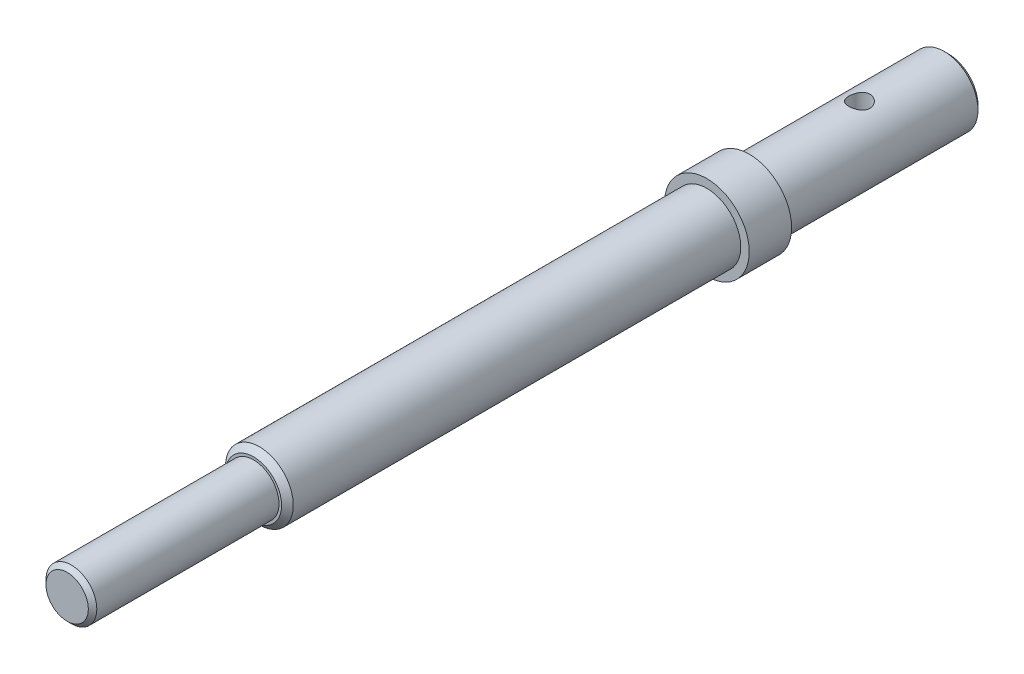
ISO-10303-21;
HEADER;
FILE_DESCRIPTION(('STEP AP214'),'2;1');
FILE_NAME('part.step','',(''),(''),'','','');
FILE_SCHEMA(('AUTOMOTIVE_DESIGN { 1 0 10303 214 1 1 1 1 }'));
ENDSEC;
DATA;
#1=APPLICATION_CONTEXT('core data for automotive mechanical design processes');
#2=APPLICATION_PROTOCOL_DEFINITION('international standard','automotive_design',2000,#1);
#3=PRODUCT_CONTEXT('',#1,'mechanical');
#4=PRODUCT('Part','Part','',(#3));
#5=PRODUCT_RELATED_PRODUCT_CATEGORY('part','',(#4));
#6=PRODUCT_DEFINITION_FORMATION('','',#4);
#7=PRODUCT_DEFINITION_CONTEXT('part definition',#1,'design');
#8=PRODUCT_DEFINITION('design','',#6,#7);
#9=PRODUCT_DEFINITION_SHAPE('','',#8);
#10=(LENGTH_UNIT() NAMED_UNIT(*) SI_UNIT(.MILLI.,.METRE.));
#11=(NAMED_UNIT(*) PLANE_ANGLE_UNIT() SI_UNIT($,.RADIAN.));
#12=(NAMED_UNIT(*) SI_UNIT($,.STERADIAN.) SOLID_ANGLE_UNIT());
#13=UNCERTAINTY_MEASURE_WITH_UNIT(LENGTH_MEASURE(1.E-05),#10,'distance_accuracy_value','');
#14=(GEOMETRIC_REPRESENTATION_CONTEXT(3) GLOBAL_UNCERTAINTY_ASSIGNED_CONTEXT((#13)) GLOBAL_UNIT_ASSIGNED_CONTEXT((#10,
#11,#12)) REPRESENTATION_CONTEXT('',''));
#15=CARTESIAN_POINT('',(0.,0.,0.));
#16=DIRECTION('',(0.,0.,1.));
#17=DIRECTION('',(1.,0.,0.));
#18=AXIS2_PLACEMENT_3D('',#15,#16,#17);
#19=CARTESIAN_POINT('',(0.,0.,52.));
#20=DIRECTION('',(0.,0.,-1.));
#21=DIRECTION('',(-1.,0.,0.));
#22=AXIS2_PLACEMENT_3D('',#19,#20,#21);
#23=CYLINDRICAL_SURFACE('',#22,4.);
#24=CARTESIAN_POINT('',(0.,0.,29.3095));
#25=DIRECTION('',(0.,0.,-1.));
#26=DIRECTION('',(-1.,0.,0.));
#27=AXIS2_PLACEMENT_3D('',#24,#25,#26);
#28=CIRCLE('',#27,4.);
#29=CARTESIAN_POINT('',(-4.,0.,29.3095));
#30=VERTEX_POINT('',#29);
#31=EDGE_CURVE('E138',#30,#30,#28,.T.);
#32=CARTESIAN_POINT('',(0.,0.,-23.5));
#33=DIRECTION('',(0.,0.,1.));
#34=DIRECTION('',(1.,0.,0.));
#35=AXIS2_PLACEMENT_3D('',#32,#33,#34);
#36=CIRCLE('',#35,4.);
#37=CARTESIAN_POINT('',(-4.,0.,-23.5));
#38=VERTEX_POINT('',#37);
#39=EDGE_CURVE('E145',#38,#38,#36,.T.);
#40=CARTESIAN_POINT('',(-4.,0.,29.3095));
#41=CARTESIAN_POINT('',(-4.,0.,28.7594010416667));
#42=CARTESIAN_POINT('',(-4.,0.,28.2093020833333));
#43=CARTESIAN_POINT('',(-4.,0.,27.1091041666667));
#44=CARTESIAN_POINT('',(-4.,0.,26.5590052083333));
#45=CARTESIAN_POINT('',(-4.,0.,25.4588072916667));
#46=CARTESIAN_POINT('',(-4.,0.,24.9087083333333));
#47=CARTESIAN_POINT('',(-4.,0.,23.8085104166667));
#48=CARTESIAN_POINT('',(-4.,0.,23.2584114583333));
#49=CARTESIAN_POINT('',(-4.,0.,22.1582135416667));
#50=CARTESIAN_POINT('',(-4.,0.,21.6081145833333));
#51=CARTESIAN_POINT('',(-4.,0.,20.5079166666667));
#52=CARTESIAN_POINT('',(-4.,0.,19.9578177083333));
#53=CARTESIAN_POINT('',(-4.,0.,18.8576197916667));
#54=CARTESIAN_POINT('',(-4.,0.,18.3075208333333));
#55=CARTESIAN_POINT('',(-4.,0.,17.2073229166667));
#56=CARTESIAN_POINT('',(-4.,0.,16.6572239583333));
#57=CARTESIAN_POINT('',(-4.,0.,15.5570260416667));
#58=CARTESIAN_POINT('',(-4.,0.,15.0069270833333));
#59=CARTESIAN_POINT('',(-4.,0.,13.9067291666667));
#60=CARTESIAN_POINT('',(-4.,0.,13.3566302083333));
#61=CARTESIAN_POINT('',(-4.,0.,12.2564322916667));
#62=CARTESIAN_POINT('',(-4.,0.,11.7063333333333));
#63=CARTESIAN_POINT('',(-4.,0.,10.6061354166667));
#64=CARTESIAN_POINT('',(-4.,0.,10.0560364583333));
#65=CARTESIAN_POINT('',(-4.,0.,8.95583854166667));
#66=CARTESIAN_POINT('',(-4.,0.,8.40573958333334));
#67=CARTESIAN_POINT('',(-4.,0.,7.30554166666667));
#68=CARTESIAN_POINT('',(-4.,0.,6.75544270833334));
#69=CARTESIAN_POINT('',(-4.,0.,5.65524479166668));
#70=CARTESIAN_POINT('',(-4.,0.,5.10514583333334));
#71=CARTESIAN_POINT('',(-4.,0.,4.00494791666667));
#72=CARTESIAN_POINT('',(-4.,0.,3.45484895833334));
#73=CARTESIAN_POINT('',(-4.,0.,2.35465104166667));
#74=CARTESIAN_POINT('',(-4.,0.,1.80455208333333));
#75=CARTESIAN_POINT('',(-4.,0.,0.704354166666666));
#76=CARTESIAN_POINT('',(-4.,0.,0.154255208333333));
#77=CARTESIAN_POINT('',(-4.,0.,-0.945942708333332));
#78=CARTESIAN_POINT('',(-4.,0.,-1.49604166666667));
#79=CARTESIAN_POINT('',(-4.,0.,-2.59623958333333));
#80=CARTESIAN_POINT('',(-4.,0.,-3.14633854166666));
#81=CARTESIAN_POINT('',(-4.,0.,-4.24653645833333));
#82=CARTESIAN_POINT('',(-4.,0.,-4.79663541666667));
#83=CARTESIAN_POINT('',(-4.,0.,-5.89683333333333));
#84=CARTESIAN_POINT('',(-4.,0.,-6.44693229166667));
#85=CARTESIAN_POINT('',(-4.,0.,-7.54713020833333));
#86=CARTESIAN_POINT('',(-4.,0.,-8.09722916666666));
#87=CARTESIAN_POINT('',(-4.,0.,-9.19742708333333));
#88=CARTESIAN_POINT('',(-4.,0.,-9.74752604166667));
#89=CARTESIAN_POINT('',(-4.,0.,-10.8477239583333));
#90=CARTESIAN_POINT('',(-4.,0.,-11.3978229166667));
#91=CARTESIAN_POINT('',(-4.,0.,-12.4980208333333));
#92=CARTESIAN_POINT('',(-4.,0.,-13.0481197916667));
#93=CARTESIAN_POINT('',(-4.,0.,-14.1483177083333));
#94=CARTESIAN_POINT('',(-4.,0.,-14.6984166666667));
#95=CARTESIAN_POINT('',(-4.,0.,-15.7986145833333));
#96=CARTESIAN_POINT('',(-4.,0.,-16.3487135416667));
#97=CARTESIAN_POINT('',(-4.,0.,-17.4489114583333));
#98=CARTESIAN_POINT('',(-4.,0.,-17.9990104166667));
#99=CARTESIAN_POINT('',(-4.,0.,-19.0992083333333));
#100=CARTESIAN_POINT('',(-4.,0.,-19.6493072916667));
#101=CARTESIAN_POINT('',(-4.,0.,-20.7495052083333));
#102=CARTESIAN_POINT('',(-4.,0.,-21.2996041666667));
#103=CARTESIAN_POINT('',(-4.,0.,-22.3998020833333));
#104=CARTESIAN_POINT('',(-4.,0.,-22.9499010416667));
#105=CARTESIAN_POINT('',(-4.,0.,-23.5));
#106=B_SPLINE_CURVE_WITH_KNOTS('',3,(#40,#41,#42,#43,#44,#45,#46,#47,#48,#49,#50,#51,#52,#53,
#54,#55,#56,#57,#58,#59,#60,#61,#62,#63,#64,#65,#66,#67,#68,#69,#70,#71,#72,#73,#74,#75,#76,#77,
#78,#79,#80,#81,#82,#83,#84,#85,#86,#87,#88,#89,#90,#91,#92,#93,#94,#95,#96,#97,#98,#99,#100,
#101,#102,#103,#104,#105),.UNSPECIFIED.,.F.,.F.,(4,2,2,2,2,2,2,2,2,2,2,2,2,2,2,2,2,2,2,2,2,2,2,
2,2,2,2,2,2,2,2,2,4),(0.,1.650296875,3.30059375,4.950890625,6.6011875,8.251484375,9.90178125,
11.552078125,13.202375,14.852671875,16.50296875,18.153265625,19.8035625,21.453859375,
23.10415625,24.754453125,26.40475,28.055046875,29.70534375,31.355640625,33.0059375,34.656234375,
36.30653125,37.956828125,39.607125,41.257421875,42.90771875,44.558015625,46.2083125,
47.858609375,49.50890625,51.159203125,52.8095),.UNSPECIFIED.);
#107=EDGE_CURVE('BSEAM49',#30,#38,#106,.T.);
#108=ORIENTED_EDGE('',*,*,#31,.T.);
#109=ORIENTED_EDGE('',*,*,#39,.T.);
#110=ORIENTED_EDGE('',*,*,#107,.T.);
#111=ORIENTED_EDGE('',*,*,#107,.F.);
#112=EDGE_LOOP('',(#108,#110,#109,#111));
#113=FACE_BOUND('',#112,.T.);
#114=ADVANCED_FACE('F49',(#113),#23,.T.);
#115=CARTESIAN_POINT('',(0.,0.,-23.5));
#116=DIRECTION('',(0.,0.,-1.));
#117=DIRECTION('',(-1.,0.,0.));
#118=AXIS2_PLACEMENT_3D('',#115,#116,#117);
#119=CYLINDRICAL_SURFACE('',#118,5.);
#120=CARTESIAN_POINT('',(0.,0.,-23.5));
#121=DIRECTION('',(0.,0.,1.));
#122=DIRECTION('',(1.,0.,0.));
#123=AXIS2_PLACEMENT_3D('',#120,#121,#122);
#124=CIRCLE('',#123,5.);
#125=CARTESIAN_POINT('',(5.,0.,-23.5));
#126=VERTEX_POINT('',#125);
#127=EDGE_CURVE('E143',#126,#126,#124,.T.);
#128=ORIENTED_EDGE('',*,*,#127,.F.);
#129=EDGE_LOOP('',(#128));
#130=FACE_BOUND('',#129,.T.);
#131=CARTESIAN_POINT('',(0.,0.,-28.5));
#132=DIRECTION('',(0.,0.,1.));
#133=DIRECTION('',(1.,0.,0.));
#134=AXIS2_PLACEMENT_3D('',#131,#132,#133);
#135=CIRCLE('',#134,5.);
#136=CARTESIAN_POINT('',(5.,0.,-28.5));
#137=VERTEX_POINT('',#136);
#138=EDGE_CURVE('E152',#137,#137,#135,.T.);
#139=ORIENTED_EDGE('',*,*,#138,.T.);
#140=EDGE_LOOP('',(#139));
#141=FACE_BOUND('',#140,.T.);
#142=ADVANCED_FACE('F116',(#130,#141),#119,.T.);
#143=CARTESIAN_POINT('',(0.,0.,-23.5));
#144=DIRECTION('',(0.,0.,1.));
#145=DIRECTION('',(1.,0.,0.));
#146=AXIS2_PLACEMENT_3D('',#143,#144,#145);
#147=PLANE('',#146);
#148=ORIENTED_EDGE('',*,*,#39,.F.);
#149=EDGE_LOOP('',(#148));
#150=FACE_BOUND('',#149,.T.);
#151=ORIENTED_EDGE('',*,*,#127,.T.);
#152=EDGE_LOOP('',(#151));
#153=FACE_BOUND('',#152,.T.);
#154=ADVANCED_FACE('F115',(#150,#153),#147,.T.);
#155=CARTESIAN_POINT('',(0.,0.,-28.5));
#156=DIRECTION('',(0.,0.,1.));
#157=DIRECTION('',(1.,0.,0.));
#158=AXIS2_PLACEMENT_3D('',#155,#156,#157);
#159=PLANE('',#158);
#160=CARTESIAN_POINT('',(0.,0.,-28.5));
#161=DIRECTION('',(0.,0.,1.));
#162=DIRECTION('',(1.,0.,0.));
#163=AXIS2_PLACEMENT_3D('',#160,#161,#162);
#164=CIRCLE('',#163,4.);
#165=CARTESIAN_POINT('',(4.,0.,-28.5));
#166=VERTEX_POINT('',#165);
#167=EDGE_CURVE('E144',#166,#166,#164,.T.);
#168=ORIENTED_EDGE('',*,*,#167,.T.);
#169=EDGE_LOOP('',(#168));
#170=FACE_BOUND('',#169,.T.);
#171=ORIENTED_EDGE('',*,*,#138,.F.);
#172=EDGE_LOOP('',(#171));
#173=FACE_BOUND('',#172,.T.);
#174=ADVANCED_FACE('F114',(#170,#173),#159,.F.);
#175=CARTESIAN_POINT('',(0.,0.,-52.));
#176=DIRECTION('',(0.,0.,1.));
#177=DIRECTION('',(1.,0.,0.));
#178=AXIS2_PLACEMENT_3D('',#175,#176,#177);
#179=PLANE('',#178);
#180=CARTESIAN_POINT('',(0.,0.,-52.));
#181=DIRECTION('',(0.,0.,1.));
#182=DIRECTION('',(1.,0.,0.));
#183=AXIS2_PLACEMENT_3D('',#180,#181,#182);
#184=CIRCLE('',#183,3.49999999999997);
#185=CARTESIAN_POINT('',(3.49999999999997,0.,-52.));
#186=VERTEX_POINT('',#185);
#187=EDGE_CURVE('E61',#186,#186,#184,.F.);
#188=ORIENTED_EDGE('',*,*,#187,.T.);
#189=EDGE_LOOP('',(#188));
#190=FACE_BOUND('',#189,.T.);
#191=ADVANCED_FACE('F119',(#190),#179,.F.);
#192=CARTESIAN_POINT('',(0.,0.,-51.5));
#193=DIRECTION('',(0.,0.,1.));
#194=DIRECTION('',(1.,0.,0.));
#195=AXIS2_PLACEMENT_3D('',#192,#193,#194);
#196=CIRCLE('',#195,4.);
#197=CARTESIAN_POINT('',(4.,0.,-51.5));
#198=VERTEX_POINT('',#197);
#199=EDGE_CURVE('E66',#198,#198,#196,.T.);
#200=ORIENTED_EDGE('',*,*,#199,.T.);
#201=EDGE_LOOP('',(#200));
#202=FACE_BOUND('',#201,.T.);
#203=CARTESIAN_POINT('',(0.,-4.,-40.25));
#204=CARTESIAN_POINT('',(0.0684391851745465,-3.99999965877989,-40.2500004465876));
#205=CARTESIAN_POINT('',(0.136883052502859,-3.99822694984841,-40.2556392269444));
#206=CARTESIAN_POINT('',(0.271769209588448,-3.99132894088807,-40.2779862415392));
#207=CARTESIAN_POINT('',(0.338211042725907,-3.9862028819986,-40.2946969813644));
#208=CARTESIAN_POINT('',(0.467128543650806,-3.97315815697909,-40.3385693711957));
#209=CARTESIAN_POINT('',(0.529610176985803,-3.96524381499025,-40.365714844653));
#210=CARTESIAN_POINT('',(0.64913480234646,-3.94743969161093,-40.4296173176783));
#211=CARTESIAN_POINT('',(0.706176935444885,-3.93754959899905,-40.4663758317806));
#212=CARTESIAN_POINT('',(0.814965334952281,-3.91650213740282,-40.5496559920174));
#213=CARTESIAN_POINT('',(0.86652002815666,-3.90531715926989,-40.5964208850611));
#214=CARTESIAN_POINT('',(0.961197382036993,-3.88310046374208,-40.6978683924135));
#215=CARTESIAN_POINT('',(1.0043184728987,-3.87206877523457,-40.7525524774945));
#216=CARTESIAN_POINT('',(1.08194336483114,-3.85111144698172,-40.8699445638081));
#217=CARTESIAN_POINT('',(1.11620784150129,-3.84121988301796,-40.9328174775272));
#218=CARTESIAN_POINT('',(1.17359741076672,-3.82407801799234,-41.0637923149819));
#219=CARTESIAN_POINT('',(1.19672543771945,-3.81682702128688,-41.1318928557939));
#220=CARTESIAN_POINT('',(1.23048459930033,-3.80607606984501,-41.2692280774521));
#221=CARTESIAN_POINT('',(1.24147110007865,-3.80246972929508,-41.3383668436389));
#222=CARTESIAN_POINT('',(1.25174555036988,-3.7991005514095,-41.4775931189119));
#223=CARTESIAN_POINT('',(1.25103660995772,-3.79933669227334,-41.5476803708217));
#224=CARTESIAN_POINT('',(1.23821824732739,-3.80353189075438,-41.683874460269));
#225=CARTESIAN_POINT('',(1.22656057869383,-3.80734341745949,-41.7500291258616));
#226=CARTESIAN_POINT('',(1.19290813355626,-3.81802025652489,-41.8793921565373));
#227=CARTESIAN_POINT('',(1.17091225844551,-3.82488589343115,-41.9426002077088));
#228=CARTESIAN_POINT('',(1.11688874681277,-3.84101044014297,-42.0653519444326));
#229=CARTESIAN_POINT('',(1.08471925662082,-3.85030284660824,-42.124828610692));
#230=CARTESIAN_POINT('',(1.01136020737848,-3.8702185658007,-42.2376877678791));
#231=CARTESIAN_POINT('',(0.970168305215773,-3.88084222394551,-42.2910686702537));
#232=CARTESIAN_POINT('',(0.877716954182126,-3.90281527800493,-42.392774943417));
#233=CARTESIAN_POINT('',(0.82608457059282,-3.91417569605696,-42.4407595577797));
#234=CARTESIAN_POINT('',(0.715364408095535,-3.9359157075958,-42.5274718935797));
#235=CARTESIAN_POINT('',(0.656276077349024,-3.94629522838372,-42.5661989292192));
#236=CARTESIAN_POINT('',(0.531664610465457,-3.96501294890191,-42.6335276886013));
#237=CARTESIAN_POINT('',(0.466094906919282,-3.97333460648208,-42.662048135464));
#238=CARTESIAN_POINT('',(0.330767977782646,-3.98687955828554,-42.7075530008516));
#239=CARTESIAN_POINT('',(0.26101203072461,-3.99210379325151,-42.7245409222384));
#240=CARTESIAN_POINT('',(0.122185157290345,-3.99871389395014,-42.745918042579));
#241=CARTESIAN_POINT('',(0.0531918487888423,-4.00024022895439,-42.7507685435935));
#242=CARTESIAN_POINT('',(-0.0846303057325848,-3.99969799730981,-42.7490337733627));
#243=CARTESIAN_POINT('',(-0.153459174306505,-3.99762995581125,-42.7424501726774));
#244=CARTESIAN_POINT('',(-0.287219332975852,-3.99022363769772,-42.7184044073936));
#245=CARTESIAN_POINT('',(-0.352204978420949,-3.98496793110725,-42.7012167323875));
#246=CARTESIAN_POINT('',(-0.478351928861366,-3.97180121379252,-42.6567856476333));
#247=CARTESIAN_POINT('',(-0.539512760449016,-3.96388987514204,-42.6295409959751));
#248=CARTESIAN_POINT('',(-0.657932406672231,-3.94598542759568,-42.5650267834512));
#249=CARTESIAN_POINT('',(-0.715059739787954,-3.9359462681821,-42.5275290125028));
#250=CARTESIAN_POINT('',(-0.822365850960094,-3.91493410002887,-42.443846789883));
#251=CARTESIAN_POINT('',(-0.872542738043336,-3.90396083845862,-42.3976599822569));
#252=CARTESIAN_POINT('',(-0.966587462919656,-3.88176994885247,-42.2957411099463));
#253=CARTESIAN_POINT('',(-1.01012652339774,-3.87055986714446,-42.2397033362547));
#254=CARTESIAN_POINT('',(-1.08721250244909,-3.84961947087602,-42.1208733836293));
#255=CARTESIAN_POINT('',(-1.12075957972524,-3.839889132814,-42.0580813119956));
#256=CARTESIAN_POINT('',(-1.17670083481141,-3.82311782360754,-41.9276548271141));
#257=CARTESIAN_POINT('',(-1.19913819558886,-3.81606646468027,-41.8600403504953));
#258=CARTESIAN_POINT('',(-1.23222894320964,-3.80551170941212,-41.7217275066762));
#259=CARTESIAN_POINT('',(-1.2428868141461,-3.80200696302675,-41.6510303236287));
#260=CARTESIAN_POINT('',(-1.2517940615754,-3.79908292712494,-41.5119959124458));
#261=CARTESIAN_POINT('',(-1.25058279621957,-3.79948604683077,-41.4436965461871));
#262=CARTESIAN_POINT('',(-1.23708818129474,-3.80390090472383,-41.3083254150808));
#263=CARTESIAN_POINT('',(-1.22480534822559,-3.80791247457319,-41.241253593116));
#264=CARTESIAN_POINT('',(-1.18987729913378,-3.81896814158112,-41.1112059603982));
#265=CARTESIAN_POINT('',(-1.16738642405944,-3.82596698183474,-41.048184558904));
#266=CARTESIAN_POINT('',(-1.11280227335064,-3.84219704261348,-40.9267595864686));
#267=CARTESIAN_POINT('',(-1.08070704444254,-3.85142871716522,-40.8683569579223));
#268=CARTESIAN_POINT('',(-1.00635675013475,-3.8715348703158,-40.7553540295594));
#269=CARTESIAN_POINT('',(-0.963753335241274,-3.88245948922441,-40.7009918704995));
#270=CARTESIAN_POINT('',(-0.870208996404849,-3.90448998821726,-40.6000136718882));
#271=CARTESIAN_POINT('',(-0.819265842344403,-3.91559591606795,-40.553399711009));
#272=CARTESIAN_POINT('',(-0.708486662823333,-3.93717271952329,-40.467717461637));
#273=CARTESIAN_POINT('',(-0.648414574487381,-3.94761101730634,-40.42894526355));
#274=CARTESIAN_POINT('',(-0.522279138013656,-3.96626769296916,-40.3621010848606));
#275=CARTESIAN_POINT('',(-0.456218157795452,-3.97448694315832,-40.3340248978582));
#276=CARTESIAN_POINT('',(-0.32574763537398,-3.98720650733461,-40.2914086323915));
#277=CARTESIAN_POINT('',(-0.261670337112547,-3.99196240806139,-40.2759251326947));
#278=CARTESIAN_POINT('',(-0.131729895440248,-3.99835900340486,-40.2552216400323));
#279=CARTESIAN_POINT('',(-0.065867116139675,-4.00000032839644,-40.249999570196));
#280=CARTESIAN_POINT('',(0.,-4.,-40.25));
#281=B_SPLINE_CURVE_WITH_KNOTS('',3,(#203,#204,#205,#206,#207,#208,#209,#210,#211,#212,#213,
#214,#215,#216,#217,#218,#219,#220,#221,#222,#223,#224,#225,#226,#227,#228,#229,#230,#231,#232,
#233,#234,#235,#236,#237,#238,#239,#240,#241,#242,#243,#244,#245,#246,#247,#248,#249,#250,#251,
#252,#253,#254,#255,#256,#257,#258,#259,#260,#261,#262,#263,#264,#265,#266,#267,#268,#269,#270,
#271,#272,#273,#274,#275,#276,#277,#278,#279,#280),.UNSPECIFIED.,.T.,.F.,(4,2,2,2,2,2,2,2,2,2,2,
2,2,2,2,2,2,2,2,2,2,2,2,2,2,2,2,2,2,2,2,2,2,2,2,2,2,2,4),(0.,0.20507544943251,0.410197323349067,
0.615002479202437,0.819839921558391,1.03037822195158,1.24095567431276,1.45673771247494,
1.67246286279527,1.88169150167211,2.09086450295139,2.2917691742217,2.49269519979063,
2.69655642720546,2.90047066010359,3.113667472796,3.32688007413303,3.5417546068977,
3.75656384494554,3.96307568548238,4.16955735649363,4.37090626722872,4.572280050345,
4.77856324738343,4.98490245709259,5.1994177871314,5.41392970983713,5.62760115751032,
5.84119123892431,6.04512203476053,6.24904331751085,6.44997913396672,6.65095584330175,
6.85979514006362,7.06869037373341,7.28440668126413,7.50003806666338,7.69744636651542,
7.89481470763048),.UNSPECIFIED.);
#282=CARTESIAN_POINT('',(0.,-4.,-40.25));
#283=VERTEX_POINT('',#282);
#284=EDGE_CURVE('E77',#283,#283,#281,.T.);
#285=ORIENTED_EDGE('',*,*,#284,.T.);
#286=EDGE_LOOP('',(#285));
#287=FACE_BOUND('',#286,.T.);
#288=CARTESIAN_POINT('',(0.,4.,-40.25));
#289=CARTESIAN_POINT('',(-0.0684391851745465,3.99999965877989,-40.2500004465876));
#290=CARTESIAN_POINT('',(-0.136883052502859,3.99822694984841,-40.2556392269444));
#291=CARTESIAN_POINT('',(-0.271769209588448,3.99132894088807,-40.2779862415392));
#292=CARTESIAN_POINT('',(-0.338211042725907,3.9862028819986,-40.2946969813644));
#293=CARTESIAN_POINT('',(-0.467128543650806,3.97315815697909,-40.3385693711957));
#294=CARTESIAN_POINT('',(-0.529610176985803,3.96524381499025,-40.365714844653));
#295=CARTESIAN_POINT('',(-0.64913480234646,3.94743969161093,-40.4296173176783));
#296=CARTESIAN_POINT('',(-0.706176935444885,3.93754959899905,-40.4663758317806));
#297=CARTESIAN_POINT('',(-0.814965334952281,3.91650213740282,-40.5496559920174));
#298=CARTESIAN_POINT('',(-0.86652002815666,3.90531715926989,-40.5964208850611));
#299=CARTESIAN_POINT('',(-0.961197382036993,3.88310046374208,-40.6978683924135));
#300=CARTESIAN_POINT('',(-1.0043184728987,3.87206877523457,-40.7525524774945));
#301=CARTESIAN_POINT('',(-1.08194336483114,3.85111144698172,-40.8699445638081));
#302=CARTESIAN_POINT('',(-1.11620784150129,3.84121988301796,-40.9328174775272));
#303=CARTESIAN_POINT('',(-1.17359741076672,3.82407801799234,-41.0637923149819));
#304=CARTESIAN_POINT('',(-1.19672543771945,3.81682702128688,-41.1318928557939));
#305=CARTESIAN_POINT('',(-1.23048459930033,3.80607606984501,-41.2692280774521));
#306=CARTESIAN_POINT('',(-1.24147110007865,3.80246972929508,-41.3383668436389));
#307=CARTESIAN_POINT('',(-1.25174555036988,3.7991005514095,-41.4775931189119));
#308=CARTESIAN_POINT('',(-1.25103660995772,3.79933669227334,-41.5476803708217));
#309=CARTESIAN_POINT('',(-1.23821824732739,3.80353189075438,-41.683874460269));
#310=CARTESIAN_POINT('',(-1.22656057869383,3.80734341745949,-41.7500291258616));
#311=CARTESIAN_POINT('',(-1.19290813355626,3.81802025652489,-41.8793921565373));
#312=CARTESIAN_POINT('',(-1.17091225844551,3.82488589343115,-41.9426002077088));
#313=CARTESIAN_POINT('',(-1.11688874681277,3.84101044014297,-42.0653519444326));
#314=CARTESIAN_POINT('',(-1.08471925662082,3.85030284660824,-42.124828610692));
#315=CARTESIAN_POINT('',(-1.01136020737848,3.8702185658007,-42.2376877678791));
#316=CARTESIAN_POINT('',(-0.970168305215773,3.88084222394551,-42.2910686702537));
#317=CARTESIAN_POINT('',(-0.877716954182126,3.90281527800493,-42.392774943417));
#318=CARTESIAN_POINT('',(-0.82608457059282,3.91417569605696,-42.4407595577797));
#319=CARTESIAN_POINT('',(-0.715364408095535,3.9359157075958,-42.5274718935797));
#320=CARTESIAN_POINT('',(-0.656276077349024,3.94629522838372,-42.5661989292192));
#321=CARTESIAN_POINT('',(-0.531664610465457,3.96501294890191,-42.6335276886013));
#322=CARTESIAN_POINT('',(-0.466094906919282,3.97333460648208,-42.662048135464));
#323=CARTESIAN_POINT('',(-0.330767977782646,3.98687955828554,-42.7075530008516));
#324=CARTESIAN_POINT('',(-0.261012030724609,3.99210379325151,-42.7245409222384));
#325=CARTESIAN_POINT('',(-0.122185157290345,3.99871389395014,-42.745918042579));
#326=CARTESIAN_POINT('',(-0.0531918487888421,4.00024022895439,-42.7507685435935));
#327=CARTESIAN_POINT('',(0.0846303057325851,3.99969799730981,-42.7490337733627));
#328=CARTESIAN_POINT('',(0.153459174306506,3.99762995581125,-42.7424501726774));
#329=CARTESIAN_POINT('',(0.287219332975853,3.99022363769772,-42.7184044073936));
#330=CARTESIAN_POINT('',(0.352204978420949,3.98496793110725,-42.7012167323875));
#331=CARTESIAN_POINT('',(0.478351928861367,3.97180121379252,-42.6567856476333));
#332=CARTESIAN_POINT('',(0.539512760449017,3.96388987514204,-42.6295409959751));
#333=CARTESIAN_POINT('',(0.657932406672234,3.94598542759568,-42.5650267834512));
#334=CARTESIAN_POINT('',(0.715059739787959,3.9359462681821,-42.5275290125028));
#335=CARTESIAN_POINT('',(0.822365850960098,3.91493410002887,-42.443846789883));
#336=CARTESIAN_POINT('',(0.872542738043336,3.90396083845862,-42.3976599822569));
#337=CARTESIAN_POINT('',(0.966587462919656,3.88176994885247,-42.2957411099463));
#338=CARTESIAN_POINT('',(1.01012652339774,3.87055986714446,-42.2397033362547));
#339=CARTESIAN_POINT('',(1.08721250244909,3.84961947087602,-42.1208733836293));
#340=CARTESIAN_POINT('',(1.12075957972524,3.839889132814,-42.0580813119956));
#341=CARTESIAN_POINT('',(1.17670083481141,3.82311782360754,-41.9276548271141));
#342=CARTESIAN_POINT('',(1.19913819558886,3.81606646468027,-41.8600403504953));
#343=CARTESIAN_POINT('',(1.23222894320964,3.80551170941212,-41.7217275066762));
#344=CARTESIAN_POINT('',(1.2428868141461,3.80200696302675,-41.6510303236287));
#345=CARTESIAN_POINT('',(1.2517940615754,3.79908292712494,-41.5119959124458));
#346=CARTESIAN_POINT('',(1.25058279621957,3.79948604683077,-41.4436965461871));
#347=CARTESIAN_POINT('',(1.23708818129474,3.80390090472383,-41.3083254150808));
#348=CARTESIAN_POINT('',(1.22480534822559,3.80791247457319,-41.241253593116));
#349=CARTESIAN_POINT('',(1.18987729913378,3.81896814158112,-41.1112059603982));
#350=CARTESIAN_POINT('',(1.16738642405944,3.82596698183474,-41.048184558904));
#351=CARTESIAN_POINT('',(1.11280227335064,3.84219704261348,-40.9267595864686));
#352=CARTESIAN_POINT('',(1.08070704444254,3.85142871716522,-40.8683569579223));
#353=CARTESIAN_POINT('',(1.00635675013475,3.8715348703158,-40.7553540295594));
#354=CARTESIAN_POINT('',(0.963753335241277,3.88245948922441,-40.7009918704995));
#355=CARTESIAN_POINT('',(0.870208996404852,3.90448998821726,-40.6000136718882));
#356=CARTESIAN_POINT('',(0.819265842344405,3.91559591606795,-40.553399711009));
#357=CARTESIAN_POINT('',(0.708486662823333,3.93717271952329,-40.467717461637));
#358=CARTESIAN_POINT('',(0.648414574487381,3.94761101730634,-40.42894526355));
#359=CARTESIAN_POINT('',(0.522279138013656,3.96626769296916,-40.3621010848606));
#360=CARTESIAN_POINT('',(0.456218157795452,3.97448694315832,-40.3340248978582));
#361=CARTESIAN_POINT('',(0.32574763537398,3.98720650733461,-40.2914086323915));
#362=CARTESIAN_POINT('',(0.261670337112547,3.99196240806139,-40.2759251326947));
#363=CARTESIAN_POINT('',(0.131729895440248,3.99835900340486,-40.2552216400323));
#364=CARTESIAN_POINT('',(0.065867116139675,4.00000032839644,-40.249999570196));
#365=CARTESIAN_POINT('',(0.,4.,-40.25));
#366=B_SPLINE_CURVE_WITH_KNOTS('',3,(#288,#289,#290,#291,#292,#293,#294,#295,#296,#297,#298,
#299,#300,#301,#302,#303,#304,#305,#306,#307,#308,#309,#310,#311,#312,#313,#314,#315,#316,#317,
#318,#319,#320,#321,#322,#323,#324,#325,#326,#327,#328,#329,#330,#331,#332,#333,#334,#335,#336,
#337,#338,#339,#340,#341,#342,#343,#344,#345,#346,#347,#348,#349,#350,#351,#352,#353,#354,#355,
#356,#357,#358,#359,#360,#361,#362,#363,#364,#365),.UNSPECIFIED.,.T.,.F.,(4,2,2,2,2,2,2,2,2,2,2,
2,2,2,2,2,2,2,2,2,2,2,2,2,2,2,2,2,2,2,2,2,2,2,2,2,2,2,4),(0.,0.20507544943251,0.410197323349067,
0.615002479202437,0.819839921558391,1.03037822195158,1.24095567431276,1.45673771247494,
1.67246286279527,1.88169150167211,2.09086450295139,2.2917691742217,2.49269519979064,
2.69655642720546,2.90047066010359,3.113667472796,3.32688007413303,3.5417546068977,
3.75656384494554,3.96307568548238,4.16955735649363,4.37090626722872,4.572280050345,
4.77856324738344,4.9849024570926,5.1994177871314,5.41392970983713,5.62760115751032,
5.84119123892431,6.04512203476053,6.24904331751085,6.44997913396672,6.65095584330175,
6.85979514006362,7.06869037373341,7.28440668126413,7.50003806666338,7.69744636651542,
7.89481470763048),.UNSPECIFIED.);
#367=CARTESIAN_POINT('',(0.,4.,-40.25));
#368=VERTEX_POINT('',#367);
#369=EDGE_CURVE('E74',#368,#368,#366,.T.);
#370=ORIENTED_EDGE('',*,*,#369,.T.);
#371=EDGE_LOOP('',(#370));
#372=FACE_BOUND('',#371,.T.);
#373=ORIENTED_EDGE('',*,*,#167,.F.);
#374=EDGE_LOOP('',(#373));
#375=FACE_BOUND('',#374,.T.);
#376=ADVANCED_FACE('F104',(#202,#287,#372,#375),#23,.T.);
#377=CARTESIAN_POINT('',(0.,0.,30.));
#378=DIRECTION('',(0.,0.,-1.));
#379=DIRECTION('',(-1.,0.,0.));
#380=AXIS2_PLACEMENT_3D('',#377,#378,#379);
#381=CONICAL_SURFACE('',#380,3.3095,0.785398163397453);
#382=ORIENTED_EDGE('',*,*,#31,.F.);
#383=EDGE_LOOP('',(#382));
#384=FACE_BOUND('',#383,.T.);
#385=CARTESIAN_POINT('',(0.,0.,30.));
#386=DIRECTION('',(0.,0.,-1.));
#387=DIRECTION('',(-1.,0.,0.));
#388=AXIS2_PLACEMENT_3D('',#385,#386,#387);
#389=CIRCLE('',#388,3.3095);
#390=CARTESIAN_POINT('',(-3.3095,0.,30.));
#391=VERTEX_POINT('',#390);
#392=EDGE_CURVE('E83',#391,#391,#389,.T.);
#393=ORIENTED_EDGE('',*,*,#392,.T.);
#394=EDGE_LOOP('',(#393));
#395=FACE_BOUND('',#394,.T.);
#396=ADVANCED_FACE('F100',(#384,#395),#381,.T.);
#397=CARTESIAN_POINT('',(0.,0.,52.));
#398=DIRECTION('',(0.,0.,1.));
#399=DIRECTION('',(1.,0.,0.));
#400=AXIS2_PLACEMENT_3D('',#397,#398,#399);
#401=PLANE('',#400);
#402=CARTESIAN_POINT('',(0.,0.,52.));
#403=DIRECTION('',(0.,0.,1.));
#404=DIRECTION('',(1.,0.,0.));
#405=AXIS2_PLACEMENT_3D('',#402,#403,#404);
#406=CIRCLE('',#405,2.5);
#407=CARTESIAN_POINT('',(2.5,0.,52.));
#408=VERTEX_POINT('',#407);
#409=EDGE_CURVE('E56',#408,#408,#406,.T.);
#410=ORIENTED_EDGE('',*,*,#409,.T.);
#411=EDGE_LOOP('',(#410));
#412=FACE_BOUND('',#411,.T.);
#413=ADVANCED_FACE('F101',(#412),#401,.T.);
#414=CARTESIAN_POINT('',(0.,0.,30.));
#415=DIRECTION('',(0.,0.,1.));
#416=DIRECTION('',(1.,0.,0.));
#417=AXIS2_PLACEMENT_3D('',#414,#415,#416);
#418=CYLINDRICAL_SURFACE('',#417,3.);
#419=CARTESIAN_POINT('',(0.,0.,51.5));
#420=DIRECTION('',(0.,0.,1.));
#421=DIRECTION('',(1.,0.,0.));
#422=AXIS2_PLACEMENT_3D('',#419,#420,#421);
#423=CIRCLE('',#422,3.);
#424=CARTESIAN_POINT('',(3.,0.,51.5));
#425=VERTEX_POINT('',#424);
#426=EDGE_CURVE('E10',#425,#425,#423,.F.);
#427=ORIENTED_EDGE('',*,*,#426,.T.);
#428=EDGE_LOOP('',(#427));
#429=FACE_BOUND('',#428,.T.);
#430=CARTESIAN_POINT('',(0.,0.,30.));
#431=DIRECTION('',(0.,0.,1.));
#432=DIRECTION('',(1.,0.,0.));
#433=AXIS2_PLACEMENT_3D('',#430,#431,#432);
#434=CIRCLE('',#433,3.);
#435=CARTESIAN_POINT('',(3.,0.,30.));
#436=VERTEX_POINT('',#435);
#437=EDGE_CURVE('E156',#436,#436,#434,.T.);
#438=ORIENTED_EDGE('',*,*,#437,.T.);
#439=EDGE_LOOP('',(#438));
#440=FACE_BOUND('',#439,.T.);
#441=ADVANCED_FACE('F106',(#429,#440),#418,.T.);
#442=CARTESIAN_POINT('',(0.,0.,30.));
#443=DIRECTION('',(0.,0.,1.));
#444=DIRECTION('',(1.,0.,0.));
#445=AXIS2_PLACEMENT_3D('',#442,#443,#444);
#446=PLANE('',#445);
#447=ORIENTED_EDGE('',*,*,#437,.F.);
#448=EDGE_LOOP('',(#447));
#449=FACE_BOUND('',#448,.T.);
#450=ORIENTED_EDGE('',*,*,#392,.F.);
#451=EDGE_LOOP('',(#450));
#452=FACE_BOUND('',#451,.T.);
#453=ADVANCED_FACE('F97',(#449,#452),#446,.T.);
#454=CARTESIAN_POINT('',(0.,-5.,-41.5));
#455=DIRECTION('',(0.,1.,0.));
#456=DIRECTION('',(0.,0.,1.));
#457=AXIS2_PLACEMENT_3D('',#454,#455,#456);
#458=CYLINDRICAL_SURFACE('',#457,1.25);
#459=ORIENTED_EDGE('',*,*,#284,.F.);
#460=EDGE_LOOP('',(#459));
#461=FACE_BOUND('',#460,.T.);
#462=ORIENTED_EDGE('',*,*,#369,.F.);
#463=EDGE_LOOP('',(#462));
#464=FACE_BOUND('',#463,.T.);
#465=ADVANCED_FACE('F95',(#461,#464),#458,.F.);
#466=CARTESIAN_POINT('',(0.,0.,-51.5));
#467=DIRECTION('',(0.,0.,1.));
#468=DIRECTION('',(1.,0.,0.));
#469=AXIS2_PLACEMENT_3D('',#466,#467,#468);
#470=CONICAL_SURFACE('',#469,4.,0.785398163397432);
#471=ORIENTED_EDGE('',*,*,#187,.F.);
#472=EDGE_LOOP('',(#471));
#473=FACE_BOUND('',#472,.T.);
#474=ORIENTED_EDGE('',*,*,#199,.F.);
#475=EDGE_LOOP('',(#474));
#476=FACE_BOUND('',#475,.T.);
#477=ADVANCED_FACE('F98',(#473,#476),#470,.T.);
#478=CARTESIAN_POINT('',(0.,0.,52.));
#479=DIRECTION('',(0.,0.,-1.));
#480=DIRECTION('',(-1.,0.,0.));
#481=AXIS2_PLACEMENT_3D('',#478,#479,#480);
#482=CONICAL_SURFACE('',#481,2.5,0.785398163397453);
#483=ORIENTED_EDGE('',*,*,#426,.F.);
#484=EDGE_LOOP('',(#483));
#485=FACE_BOUND('',#484,.T.);
#486=ORIENTED_EDGE('',*,*,#409,.F.);
#487=EDGE_LOOP('',(#486));
#488=FACE_BOUND('',#487,.T.);
#489=ADVANCED_FACE('F52',(#485,#488),#482,.T.);
#490=CLOSED_SHELL('',(#114,#142,#154,#174,#191,#376,#396,#413,#441,#453,#465,#477,#489));
#491=MANIFOLD_SOLID_BREP('B2',#490);
#492=ADVANCED_BREP_SHAPE_REPRESENTATION('',(#18,#491),#14);
#493=SHAPE_DEFINITION_REPRESENTATION(#9,#492);
ENDSEC;
END-ISO-10303-21;
